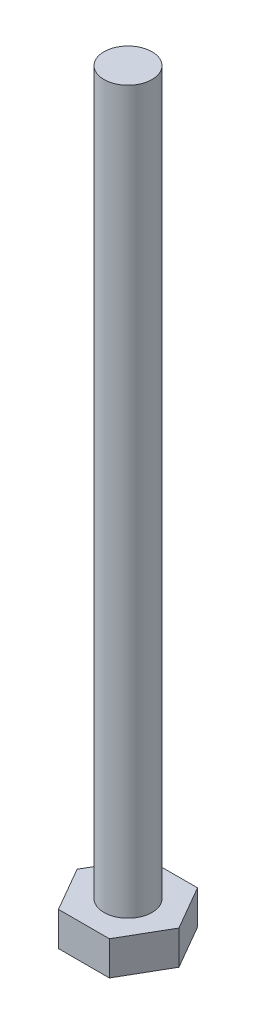
ISO-10303-21;
HEADER;
FILE_DESCRIPTION(('STEP AP214'),'2;1');
FILE_NAME('part.step','',(''),(''),'','','');
FILE_SCHEMA(('AUTOMOTIVE_DESIGN { 1 0 10303 214 1 1 1 1 }'));
ENDSEC;
DATA;
#1=APPLICATION_CONTEXT('core data for automotive mechanical design processes');
#2=APPLICATION_PROTOCOL_DEFINITION('international standard','automotive_design',2000,#1);
#3=PRODUCT_CONTEXT('',#1,'mechanical');
#4=PRODUCT('Part','Part','',(#3));
#5=PRODUCT_RELATED_PRODUCT_CATEGORY('part','',(#4));
#6=PRODUCT_DEFINITION_FORMATION('','',#4);
#7=PRODUCT_DEFINITION_CONTEXT('part definition',#1,'design');
#8=PRODUCT_DEFINITION('design','',#6,#7);
#9=PRODUCT_DEFINITION_SHAPE('','',#8);
#10=(LENGTH_UNIT() NAMED_UNIT(*) SI_UNIT(.MILLI.,.METRE.));
#11=(NAMED_UNIT(*) PLANE_ANGLE_UNIT() SI_UNIT($,.RADIAN.));
#12=(NAMED_UNIT(*) SI_UNIT($,.STERADIAN.) SOLID_ANGLE_UNIT());
#13=UNCERTAINTY_MEASURE_WITH_UNIT(LENGTH_MEASURE(1.E-05),#10,'distance_accuracy_value','');
#14=(GEOMETRIC_REPRESENTATION_CONTEXT(3) GLOBAL_UNCERTAINTY_ASSIGNED_CONTEXT((#13)) GLOBAL_UNIT_ASSIGNED_CONTEXT((#10,
#11,#12)) REPRESENTATION_CONTEXT('',''));
#15=CARTESIAN_POINT('',(0.,0.,0.));
#16=DIRECTION('',(0.,0.,1.));
#17=DIRECTION('',(1.,0.,0.));
#18=AXIS2_PLACEMENT_3D('',#15,#16,#17);
#19=CARTESIAN_POINT('',(0.,45.,0.));
#20=DIRECTION('',(0.,-1.,0.));
#21=DIRECTION('',(0.,0.,-1.));
#22=AXIS2_PLACEMENT_3D('',#19,#20,#21);
#23=CYLINDRICAL_SURFACE('',#22,1.5);
#24=CARTESIAN_POINT('',(0.,45.,0.));
#25=DIRECTION('',(0.,1.,0.));
#26=DIRECTION('',(0.,0.,1.));
#27=AXIS2_PLACEMENT_3D('',#24,#25,#26);
#28=CIRCLE('',#27,1.5);
#29=CARTESIAN_POINT('',(0.,45.,-1.5));
#30=VERTEX_POINT('',#29);
#31=EDGE_CURVE('E11',#30,#30,#28,.T.);
#32=CARTESIAN_POINT('',(0.,0.,0.));
#33=DIRECTION('',(0.,1.,0.));
#34=DIRECTION('',(0.,0.,1.));
#35=AXIS2_PLACEMENT_3D('',#32,#33,#34);
#36=CIRCLE('',#35,1.5);
#37=CARTESIAN_POINT('',(0.,0.,-1.5));
#38=VERTEX_POINT('',#37);
#39=EDGE_CURVE('E37',#38,#38,#36,.T.);
#40=CARTESIAN_POINT('',(0.,45.,-1.5));
#41=CARTESIAN_POINT('',(0.,44.53125,-1.5));
#42=CARTESIAN_POINT('',(0.,44.0625,-1.5));
#43=CARTESIAN_POINT('',(0.,43.125,-1.5));
#44=CARTESIAN_POINT('',(0.,42.65625,-1.5));
#45=CARTESIAN_POINT('',(0.,41.71875,-1.5));
#46=CARTESIAN_POINT('',(0.,41.25,-1.5));
#47=CARTESIAN_POINT('',(0.,40.3125,-1.5));
#48=CARTESIAN_POINT('',(0.,39.84375,-1.5));
#49=CARTESIAN_POINT('',(0.,38.90625,-1.5));
#50=CARTESIAN_POINT('',(0.,38.4375,-1.5));
#51=CARTESIAN_POINT('',(0.,37.5,-1.5));
#52=CARTESIAN_POINT('',(0.,37.03125,-1.5));
#53=CARTESIAN_POINT('',(0.,36.09375,-1.5));
#54=CARTESIAN_POINT('',(0.,35.625,-1.5));
#55=CARTESIAN_POINT('',(0.,34.6875,-1.5));
#56=CARTESIAN_POINT('',(0.,34.21875,-1.5));
#57=CARTESIAN_POINT('',(0.,33.28125,-1.5));
#58=CARTESIAN_POINT('',(0.,32.8125,-1.5));
#59=CARTESIAN_POINT('',(0.,31.875,-1.5));
#60=CARTESIAN_POINT('',(0.,31.40625,-1.5));
#61=CARTESIAN_POINT('',(0.,30.46875,-1.5));
#62=CARTESIAN_POINT('',(0.,30.,-1.5));
#63=CARTESIAN_POINT('',(0.,29.0625,-1.5));
#64=CARTESIAN_POINT('',(0.,28.59375,-1.5));
#65=CARTESIAN_POINT('',(0.,27.65625,-1.5));
#66=CARTESIAN_POINT('',(0.,27.1875,-1.5));
#67=CARTESIAN_POINT('',(0.,26.25,-1.5));
#68=CARTESIAN_POINT('',(0.,25.78125,-1.5));
#69=CARTESIAN_POINT('',(0.,24.84375,-1.5));
#70=CARTESIAN_POINT('',(0.,24.375,-1.5));
#71=CARTESIAN_POINT('',(0.,23.4375,-1.5));
#72=CARTESIAN_POINT('',(0.,22.96875,-1.5));
#73=CARTESIAN_POINT('',(0.,22.03125,-1.5));
#74=CARTESIAN_POINT('',(0.,21.5625,-1.5));
#75=CARTESIAN_POINT('',(0.,20.625,-1.5));
#76=CARTESIAN_POINT('',(0.,20.15625,-1.5));
#77=CARTESIAN_POINT('',(0.,19.21875,-1.5));
#78=CARTESIAN_POINT('',(0.,18.75,-1.5));
#79=CARTESIAN_POINT('',(0.,17.8125,-1.5));
#80=CARTESIAN_POINT('',(0.,17.34375,-1.5));
#81=CARTESIAN_POINT('',(0.,16.40625,-1.5));
#82=CARTESIAN_POINT('',(0.,15.9375,-1.5));
#83=CARTESIAN_POINT('',(0.,15.,-1.5));
#84=CARTESIAN_POINT('',(0.,14.53125,-1.5));
#85=CARTESIAN_POINT('',(0.,13.59375,-1.5));
#86=CARTESIAN_POINT('',(0.,13.125,-1.5));
#87=CARTESIAN_POINT('',(0.,12.1875,-1.5));
#88=CARTESIAN_POINT('',(0.,11.71875,-1.5));
#89=CARTESIAN_POINT('',(0.,10.78125,-1.5));
#90=CARTESIAN_POINT('',(0.,10.3125,-1.5));
#91=CARTESIAN_POINT('',(0.,9.37499999999999,-1.5));
#92=CARTESIAN_POINT('',(0.,8.90624999999999,-1.5));
#93=CARTESIAN_POINT('',(0.,7.96874999999999,-1.5));
#94=CARTESIAN_POINT('',(0.,7.5,-1.5));
#95=CARTESIAN_POINT('',(0.,6.56249999999999,-1.5));
#96=CARTESIAN_POINT('',(0.,6.09374999999999,-1.5));
#97=CARTESIAN_POINT('',(0.,5.15624999999999,-1.5));
#98=CARTESIAN_POINT('',(0.,4.68749999999999,-1.5));
#99=CARTESIAN_POINT('',(0.,3.74999999999999,-1.5));
#100=CARTESIAN_POINT('',(0.,3.28124999999999,-1.5));
#101=CARTESIAN_POINT('',(0.,2.34374999999999,-1.5));
#102=CARTESIAN_POINT('',(0.,1.87499999999999,-1.5));
#103=CARTESIAN_POINT('',(0.,0.937499999999992,-1.5));
#104=CARTESIAN_POINT('',(0.,0.468749999999993,-1.5));
#105=CARTESIAN_POINT('',(0.,0.,-1.5));
#106=B_SPLINE_CURVE_WITH_KNOTS('',3,(#40,#41,#42,#43,#44,#45,#46,#47,#48,#49,#50,#51,#52,#53,
#54,#55,#56,#57,#58,#59,#60,#61,#62,#63,#64,#65,#66,#67,#68,#69,#70,#71,#72,#73,#74,#75,#76,#77,
#78,#79,#80,#81,#82,#83,#84,#85,#86,#87,#88,#89,#90,#91,#92,#93,#94,#95,#96,#97,#98,#99,#100,
#101,#102,#103,#104,#105),.UNSPECIFIED.,.F.,.F.,(4,2,2,2,2,2,2,2,2,2,2,2,2,2,2,2,2,2,2,2,2,2,2,
2,2,2,2,2,2,2,2,2,4),(0.,1.40625,2.8125,4.21874999999999,5.625,7.03125,8.43749999999999,9.84375,
11.25,12.65625,14.0625,15.46875,16.875,18.28125,19.6875,21.09375,22.5,23.90625,25.3125,26.71875,
28.125,29.53125,30.9375,32.34375,33.75,35.15625,36.5625,37.96875,39.375,40.78125,42.1875,
43.59375,45.),.UNSPECIFIED.);
#107=EDGE_CURVE('BSEAM34',#30,#38,#106,.T.);
#108=ORIENTED_EDGE('',*,*,#31,.F.);
#109=ORIENTED_EDGE('',*,*,#39,.T.);
#110=ORIENTED_EDGE('',*,*,#107,.T.);
#111=ORIENTED_EDGE('',*,*,#107,.F.);
#112=EDGE_LOOP('',(#108,#110,#109,#111));
#113=FACE_BOUND('',#112,.T.);
#114=ADVANCED_FACE('F34',(#113),#23,.T.);
#115=CARTESIAN_POINT('',(0.,45.,0.));
#116=DIRECTION('',(0.,1.,0.));
#117=DIRECTION('',(0.,0.,1.));
#118=AXIS2_PLACEMENT_3D('',#115,#116,#117);
#119=PLANE('',#118);
#120=ORIENTED_EDGE('',*,*,#31,.T.);
#121=EDGE_LOOP('',(#120));
#122=FACE_BOUND('',#121,.T.);
#123=ADVANCED_FACE('F161',(#122),#119,.T.);
#124=CARTESIAN_POINT('',(-3.17542648054294,-2.12,0.));
#125=DIRECTION('',(0.866025403784439,0.,0.5));
#126=DIRECTION('',(0.5,0.,-0.866025403784439));
#127=AXIS2_PLACEMENT_3D('',#124,#125,#126);
#128=PLANE('',#127);
#129=DIRECTION('',(0.5,0.,-0.866025403784439));
#130=VECTOR('',#129,1.);
#131=CARTESIAN_POINT('',(-3.17542648054294,0.,0.));
#132=LINE('',#131,#130);
#133=CARTESIAN_POINT('',(-3.17542648054294,0.,0.));
#134=VERTEX_POINT('',#133);
#135=CARTESIAN_POINT('',(-1.58771324027147,0.,-2.75));
#136=VERTEX_POINT('',#135);
#137=EDGE_CURVE('E119',#134,#136,#132,.T.);
#138=ORIENTED_EDGE('',*,*,#137,.T.);
#139=DIRECTION('',(0.,1.,0.));
#140=VECTOR('',#139,1.);
#141=CARTESIAN_POINT('',(-1.58771324027147,-2.12,-2.75));
#142=LINE('',#141,#140);
#143=CARTESIAN_POINT('',(-1.58771324027147,-2.12,-2.75));
#144=VERTEX_POINT('',#143);
#145=EDGE_CURVE('E136',#144,#136,#142,.T.);
#146=ORIENTED_EDGE('',*,*,#145,.F.);
#147=DIRECTION('',(0.5,0.,-0.866025403784439));
#148=VECTOR('',#147,1.);
#149=CARTESIAN_POINT('',(-3.17542648054294,-2.12,0.));
#150=LINE('',#149,#148);
#151=CARTESIAN_POINT('',(-3.17542648054294,-2.12,0.));
#152=VERTEX_POINT('',#151);
#153=EDGE_CURVE('E129',#152,#144,#150,.T.);
#154=ORIENTED_EDGE('',*,*,#153,.F.);
#155=DIRECTION('',(0.,1.,0.));
#156=VECTOR('',#155,1.);
#157=CARTESIAN_POINT('',(-3.17542648054294,-2.12,0.));
#158=LINE('',#157,#156);
#159=EDGE_CURVE('E115',#152,#134,#158,.T.);
#160=ORIENTED_EDGE('',*,*,#159,.T.);
#161=EDGE_LOOP('',(#138,#146,#154,#160));
#162=FACE_BOUND('',#161,.T.);
#163=ADVANCED_FACE('F149',(#162),#128,.F.);
#164=CARTESIAN_POINT('',(-1.58771324027147,-2.12,-2.75));
#165=DIRECTION('',(0.,0.,1.));
#166=DIRECTION('',(1.,0.,0.));
#167=AXIS2_PLACEMENT_3D('',#164,#165,#166);
#168=PLANE('',#167);
#169=DIRECTION('',(1.,0.,0.));
#170=VECTOR('',#169,1.);
#171=CARTESIAN_POINT('',(-1.58771324027147,0.,-2.75));
#172=LINE('',#171,#170);
#173=CARTESIAN_POINT('',(1.58771324027147,0.,-2.75));
#174=VERTEX_POINT('',#173);
#175=EDGE_CURVE('E122',#136,#174,#172,.T.);
#176=ORIENTED_EDGE('',*,*,#175,.T.);
#177=DIRECTION('',(0.,1.,0.));
#178=VECTOR('',#177,1.);
#179=CARTESIAN_POINT('',(1.58771324027147,-2.12,-2.75));
#180=LINE('',#179,#178);
#181=CARTESIAN_POINT('',(1.58771324027147,-2.12,-2.75));
#182=VERTEX_POINT('',#181);
#183=EDGE_CURVE('E133',#182,#174,#180,.T.);
#184=ORIENTED_EDGE('',*,*,#183,.F.);
#185=DIRECTION('',(1.,0.,0.));
#186=VECTOR('',#185,1.);
#187=CARTESIAN_POINT('',(-1.58771324027147,-2.12,-2.75));
#188=LINE('',#187,#186);
#189=EDGE_CURVE('E88',#144,#182,#188,.T.);
#190=ORIENTED_EDGE('',*,*,#189,.F.);
#191=ORIENTED_EDGE('',*,*,#145,.T.);
#192=EDGE_LOOP('',(#176,#184,#190,#191));
#193=FACE_BOUND('',#192,.T.);
#194=ADVANCED_FACE('F171',(#193),#168,.F.);
#195=CARTESIAN_POINT('',(1.58771324027147,-2.12,-2.75));
#196=DIRECTION('',(-0.866025403784439,0.,0.5));
#197=DIRECTION('',(0.5,0.,0.866025403784439));
#198=AXIS2_PLACEMENT_3D('',#195,#196,#197);
#199=PLANE('',#198);
#200=DIRECTION('',(0.5,0.,0.866025403784439));
#201=VECTOR('',#200,1.);
#202=CARTESIAN_POINT('',(1.58771324027147,0.,-2.75));
#203=LINE('',#202,#201);
#204=CARTESIAN_POINT('',(3.17542648054294,0.,0.));
#205=VERTEX_POINT('',#204);
#206=EDGE_CURVE('E124',#174,#205,#203,.T.);
#207=ORIENTED_EDGE('',*,*,#206,.T.);
#208=DIRECTION('',(0.,1.,0.));
#209=VECTOR('',#208,1.);
#210=CARTESIAN_POINT('',(3.17542648054294,-2.12,0.));
#211=LINE('',#210,#209);
#212=CARTESIAN_POINT('',(3.17542648054294,-2.12,0.));
#213=VERTEX_POINT('',#212);
#214=EDGE_CURVE('E110',#213,#205,#211,.T.);
#215=ORIENTED_EDGE('',*,*,#214,.F.);
#216=DIRECTION('',(0.5,0.,0.866025403784439));
#217=VECTOR('',#216,1.);
#218=CARTESIAN_POINT('',(1.58771324027147,-2.12,-2.75));
#219=LINE('',#218,#217);
#220=EDGE_CURVE('E101',#182,#213,#219,.T.);
#221=ORIENTED_EDGE('',*,*,#220,.F.);
#222=ORIENTED_EDGE('',*,*,#183,.T.);
#223=EDGE_LOOP('',(#207,#215,#221,#222));
#224=FACE_BOUND('',#223,.T.);
#225=ADVANCED_FACE('F176',(#224),#199,.F.);
#226=CARTESIAN_POINT('',(3.17542648054294,-2.12,0.));
#227=DIRECTION('',(-0.866025403784439,0.,-0.5));
#228=DIRECTION('',(-0.5,0.,0.866025403784439));
#229=AXIS2_PLACEMENT_3D('',#226,#227,#228);
#230=PLANE('',#229);
#231=DIRECTION('',(-0.5,0.,0.866025403784438));
#232=VECTOR('',#231,1.);
#233=CARTESIAN_POINT('',(3.17542648054294,0.,0.));
#234=LINE('',#233,#232);
#235=CARTESIAN_POINT('',(1.58771324027147,0.,2.75));
#236=VERTEX_POINT('',#235);
#237=EDGE_CURVE('E109',#205,#236,#234,.T.);
#238=ORIENTED_EDGE('',*,*,#237,.T.);
#239=DIRECTION('',(0.,1.,0.));
#240=VECTOR('',#239,1.);
#241=CARTESIAN_POINT('',(1.58771324027147,-2.12,2.75));
#242=LINE('',#241,#240);
#243=CARTESIAN_POINT('',(1.58771324027147,-2.12,2.75));
#244=VERTEX_POINT('',#243);
#245=EDGE_CURVE('E106',#244,#236,#242,.T.);
#246=ORIENTED_EDGE('',*,*,#245,.F.);
#247=DIRECTION('',(-0.5,0.,0.866025403784438));
#248=VECTOR('',#247,1.);
#249=CARTESIAN_POINT('',(3.17542648054294,-2.12,0.));
#250=LINE('',#249,#248);
#251=EDGE_CURVE('E95',#213,#244,#250,.T.);
#252=ORIENTED_EDGE('',*,*,#251,.F.);
#253=ORIENTED_EDGE('',*,*,#214,.T.);
#254=EDGE_LOOP('',(#238,#246,#252,#253));
#255=FACE_BOUND('',#254,.T.);
#256=ADVANCED_FACE('F107',(#255),#230,.F.);
#257=CARTESIAN_POINT('',(1.58771324027147,-2.12,2.75));
#258=DIRECTION('',(0.,0.,-1.));
#259=DIRECTION('',(-1.,0.,0.));
#260=AXIS2_PLACEMENT_3D('',#257,#258,#259);
#261=PLANE('',#260);
#262=DIRECTION('',(-1.,0.,0.));
#263=VECTOR('',#262,1.);
#264=CARTESIAN_POINT('',(1.58771324027147,0.,2.75));
#265=LINE('',#264,#263);
#266=CARTESIAN_POINT('',(-1.58771324027147,0.,2.75));
#267=VERTEX_POINT('',#266);
#268=EDGE_CURVE('E73',#236,#267,#265,.T.);
#269=ORIENTED_EDGE('',*,*,#268,.T.);
#270=DIRECTION('',(0.,1.,0.));
#271=VECTOR('',#270,1.);
#272=CARTESIAN_POINT('',(-1.58771324027147,-2.12,2.75));
#273=LINE('',#272,#271);
#274=CARTESIAN_POINT('',(-1.58771324027147,-2.12,2.75));
#275=VERTEX_POINT('',#274);
#276=EDGE_CURVE('E111',#275,#267,#273,.T.);
#277=ORIENTED_EDGE('',*,*,#276,.F.);
#278=DIRECTION('',(-1.,0.,0.));
#279=VECTOR('',#278,1.);
#280=CARTESIAN_POINT('',(1.58771324027147,-2.12,2.75));
#281=LINE('',#280,#279);
#282=EDGE_CURVE('E99',#244,#275,#281,.T.);
#283=ORIENTED_EDGE('',*,*,#282,.F.);
#284=ORIENTED_EDGE('',*,*,#245,.T.);
#285=EDGE_LOOP('',(#269,#277,#283,#284));
#286=FACE_BOUND('',#285,.T.);
#287=ADVANCED_FACE('F113',(#286),#261,.F.);
#288=CARTESIAN_POINT('',(-1.58771324027147,-2.12,2.75));
#289=DIRECTION('',(0.866025403784438,0.,-0.5));
#290=DIRECTION('',(-0.5,0.,-0.866025403784439));
#291=AXIS2_PLACEMENT_3D('',#288,#289,#290);
#292=PLANE('',#291);
#293=DIRECTION('',(-0.5,0.,-0.866025403784438));
#294=VECTOR('',#293,1.);
#295=CARTESIAN_POINT('',(-1.58771324027147,0.,2.75));
#296=LINE('',#295,#294);
#297=EDGE_CURVE('E79',#267,#134,#296,.T.);
#298=ORIENTED_EDGE('',*,*,#297,.T.);
#299=ORIENTED_EDGE('',*,*,#159,.F.);
#300=DIRECTION('',(-0.5,0.,-0.866025403784438));
#301=VECTOR('',#300,1.);
#302=CARTESIAN_POINT('',(-1.58771324027147,-2.12,2.75));
#303=LINE('',#302,#301);
#304=EDGE_CURVE('E50',#275,#152,#303,.T.);
#305=ORIENTED_EDGE('',*,*,#304,.F.);
#306=ORIENTED_EDGE('',*,*,#276,.T.);
#307=EDGE_LOOP('',(#298,#299,#305,#306));
#308=FACE_BOUND('',#307,.T.);
#309=ADVANCED_FACE('F151',(#308),#292,.F.);
#310=CARTESIAN_POINT('',(0.,-2.12,0.));
#311=DIRECTION('',(0.,-1.,0.));
#312=DIRECTION('',(0.,0.,-1.));
#313=AXIS2_PLACEMENT_3D('',#310,#311,#312);
#314=PLANE('',#313);
#315=ORIENTED_EDGE('',*,*,#153,.T.);
#316=ORIENTED_EDGE('',*,*,#189,.T.);
#317=ORIENTED_EDGE('',*,*,#220,.T.);
#318=ORIENTED_EDGE('',*,*,#251,.T.);
#319=ORIENTED_EDGE('',*,*,#282,.T.);
#320=ORIENTED_EDGE('',*,*,#304,.T.);
#321=EDGE_LOOP('',(#315,#316,#317,#318,#319,#320));
#322=FACE_BOUND('',#321,.T.);
#323=ADVANCED_FACE('F97',(#322),#314,.T.);
#324=CARTESIAN_POINT('',(0.,0.,0.));
#325=DIRECTION('',(0.,-1.,0.));
#326=DIRECTION('',(0.,0.,-1.));
#327=AXIS2_PLACEMENT_3D('',#324,#325,#326);
#328=PLANE('',#327);
#329=ORIENTED_EDGE('',*,*,#39,.F.);
#330=EDGE_LOOP('',(#329));
#331=FACE_BOUND('',#330,.T.);
#332=ORIENTED_EDGE('',*,*,#137,.F.);
#333=ORIENTED_EDGE('',*,*,#297,.F.);
#334=ORIENTED_EDGE('',*,*,#268,.F.);
#335=ORIENTED_EDGE('',*,*,#237,.F.);
#336=ORIENTED_EDGE('',*,*,#206,.F.);
#337=ORIENTED_EDGE('',*,*,#175,.F.);
#338=EDGE_LOOP('',(#332,#333,#334,#335,#336,#337));
#339=FACE_BOUND('',#338,.T.);
#340=ADVANCED_FACE('F142',(#331,#339),#328,.F.);
#341=CLOSED_SHELL('',(#114,#123,#163,#194,#225,#256,#287,#309,#323,#340));
#342=MANIFOLD_SOLID_BREP('B2',#341);
#343=ADVANCED_BREP_SHAPE_REPRESENTATION('',(#18,#342),#14);
#344=SHAPE_DEFINITION_REPRESENTATION(#9,#343);
ENDSEC;
END-ISO-10303-21;
